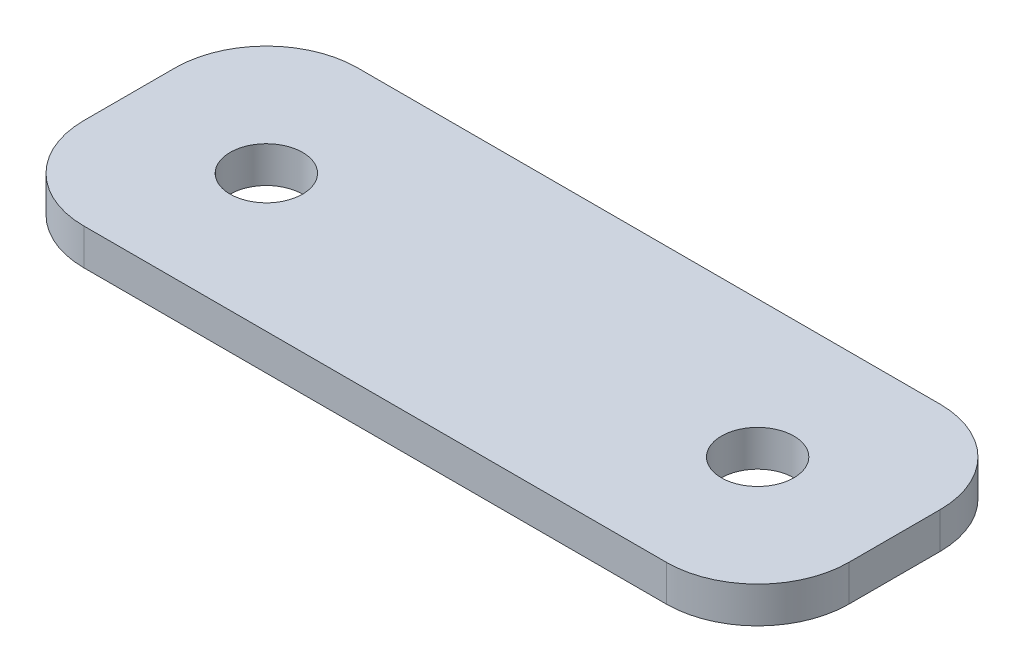
ISO-10303-21;
HEADER;
FILE_DESCRIPTION(('STEP AP214'),'2;1');
FILE_NAME('part.step','',(''),(''),'','','');
FILE_SCHEMA(('AUTOMOTIVE_DESIGN { 1 0 10303 214 1 1 1 1 }'));
ENDSEC;
DATA;
#1=APPLICATION_CONTEXT('core data for automotive mechanical design processes');
#2=APPLICATION_PROTOCOL_DEFINITION('international standard','automotive_design',2000,#1);
#3=PRODUCT_CONTEXT('',#1,'mechanical');
#4=PRODUCT('Part','Part','',(#3));
#5=PRODUCT_RELATED_PRODUCT_CATEGORY('part','',(#4));
#6=PRODUCT_DEFINITION_FORMATION('','',#4);
#7=PRODUCT_DEFINITION_CONTEXT('part definition',#1,'design');
#8=PRODUCT_DEFINITION('design','',#6,#7);
#9=PRODUCT_DEFINITION_SHAPE('','',#8);
#10=(LENGTH_UNIT() NAMED_UNIT(*) SI_UNIT(.MILLI.,.METRE.));
#11=(NAMED_UNIT(*) PLANE_ANGLE_UNIT() SI_UNIT($,.RADIAN.));
#12=(NAMED_UNIT(*) SI_UNIT($,.STERADIAN.) SOLID_ANGLE_UNIT());
#13=UNCERTAINTY_MEASURE_WITH_UNIT(LENGTH_MEASURE(1.E-05),#10,'distance_accuracy_value','');
#14=(GEOMETRIC_REPRESENTATION_CONTEXT(3) GLOBAL_UNCERTAINTY_ASSIGNED_CONTEXT((#13)) GLOBAL_UNIT_ASSIGNED_CONTEXT((#10,
#11,#12)) REPRESENTATION_CONTEXT('',''));
#15=CARTESIAN_POINT('',(0.,0.,0.));
#16=DIRECTION('',(0.,0.,1.));
#17=DIRECTION('',(1.,0.,0.));
#18=AXIS2_PLACEMENT_3D('',#15,#16,#17);
#19=CARTESIAN_POINT('',(0.,0.79375,0.));
#20=DIRECTION('',(0.,1.,0.));
#21=DIRECTION('',(0.,0.,1.));
#22=AXIS2_PLACEMENT_3D('',#19,#20,#21);
#23=PLANE('',#22);
#24=CARTESIAN_POINT('',(-10.765,0.79375,0.));
#25=DIRECTION('',(0.,1.,0.));
#26=DIRECTION('',(0.,0.,1.));
#27=AXIS2_PLACEMENT_3D('',#24,#25,#26);
#28=CIRCLE('',#27,1.5875);
#29=CARTESIAN_POINT('',(-10.765,0.79375,1.5875));
#30=VERTEX_POINT('',#29);
#31=EDGE_CURVE('E172',#30,#30,#28,.T.);
#32=ORIENTED_EDGE('',*,*,#31,.F.);
#33=EDGE_LOOP('',(#32));
#34=FACE_BOUND('',#33,.T.);
#35=DIRECTION('',(1.,0.,0.));
#36=VECTOR('',#35,1.);
#37=CARTESIAN_POINT('',(16.765,0.79375,6.));
#38=LINE('',#37,#36);
#39=CARTESIAN_POINT('',(-12.765,0.79375,6.));
#40=VERTEX_POINT('',#39);
#41=CARTESIAN_POINT('',(12.765,0.79375,6.));
#42=VERTEX_POINT('',#41);
#43=EDGE_CURVE('E167',#40,#42,#38,.T.);
#44=ORIENTED_EDGE('',*,*,#43,.T.);
#45=CARTESIAN_POINT('',(12.765,0.79375,2.));
#46=DIRECTION('',(0.,1.,0.));
#47=DIRECTION('',(0.,0.,1.));
#48=AXIS2_PLACEMENT_3D('',#45,#46,#47);
#49=CIRCLE('',#48,4.);
#50=CARTESIAN_POINT('',(16.765,0.79375,2.));
#51=VERTEX_POINT('',#50);
#52=EDGE_CURVE('E148',#42,#51,#49,.T.);
#53=ORIENTED_EDGE('',*,*,#52,.T.);
#54=DIRECTION('',(0.,0.,-1.));
#55=VECTOR('',#54,1.);
#56=CARTESIAN_POINT('',(16.765,0.79375,6.));
#57=LINE('',#56,#55);
#58=CARTESIAN_POINT('',(16.765,0.79375,-2.));
#59=VERTEX_POINT('',#58);
#60=EDGE_CURVE('E118',#51,#59,#57,.T.);
#61=ORIENTED_EDGE('',*,*,#60,.T.);
#62=CARTESIAN_POINT('',(12.765,0.79375,-2.));
#63=DIRECTION('',(0.,1.,0.));
#64=DIRECTION('',(0.,0.,1.));
#65=AXIS2_PLACEMENT_3D('',#62,#63,#64);
#66=CIRCLE('',#65,4.);
#67=CARTESIAN_POINT('',(12.765,0.79375,-6.));
#68=VERTEX_POINT('',#67);
#69=EDGE_CURVE('E54',#59,#68,#66,.T.);
#70=ORIENTED_EDGE('',*,*,#69,.T.);
#71=DIRECTION('',(-1.,0.,0.));
#72=VECTOR('',#71,1.);
#73=CARTESIAN_POINT('',(16.765,0.79375,-6.));
#74=LINE('',#73,#72);
#75=CARTESIAN_POINT('',(-12.765,0.79375,-6.));
#76=VERTEX_POINT('',#75);
#77=EDGE_CURVE('E134',#68,#76,#74,.T.);
#78=ORIENTED_EDGE('',*,*,#77,.T.);
#79=CARTESIAN_POINT('',(-12.765,0.79375,-2.));
#80=DIRECTION('',(0.,1.,0.));
#81=DIRECTION('',(0.,0.,1.));
#82=AXIS2_PLACEMENT_3D('',#79,#80,#81);
#83=CIRCLE('',#82,4.);
#84=CARTESIAN_POINT('',(-16.765,0.79375,-2.));
#85=VERTEX_POINT('',#84);
#86=EDGE_CURVE('E145',#76,#85,#83,.T.);
#87=ORIENTED_EDGE('',*,*,#86,.T.);
#88=DIRECTION('',(0.,0.,1.));
#89=VECTOR('',#88,1.);
#90=CARTESIAN_POINT('',(-16.765,0.79375,6.));
#91=LINE('',#90,#89);
#92=CARTESIAN_POINT('',(-16.765,0.79375,2.));
#93=VERTEX_POINT('',#92);
#94=EDGE_CURVE('E128',#85,#93,#91,.T.);
#95=ORIENTED_EDGE('',*,*,#94,.T.);
#96=CARTESIAN_POINT('',(-12.765,0.79375,2.));
#97=DIRECTION('',(0.,1.,0.));
#98=DIRECTION('',(0.,0.,1.));
#99=AXIS2_PLACEMENT_3D('',#96,#97,#98);
#100=CIRCLE('',#99,4.);
#101=EDGE_CURVE('E143',#93,#40,#100,.T.);
#102=ORIENTED_EDGE('',*,*,#101,.T.);
#103=EDGE_LOOP('',(#44,#53,#61,#70,#78,#87,#95,#102));
#104=FACE_BOUND('',#103,.T.);
#105=CARTESIAN_POINT('',(10.765,0.79375,0.));
#106=DIRECTION('',(0.,1.,0.));
#107=DIRECTION('',(0.,0.,1.));
#108=AXIS2_PLACEMENT_3D('',#105,#106,#107);
#109=CIRCLE('',#108,1.5875);
#110=CARTESIAN_POINT('',(10.765,0.79375,1.5875));
#111=VERTEX_POINT('',#110);
#112=EDGE_CURVE('E181',#111,#111,#109,.T.);
#113=ORIENTED_EDGE('',*,*,#112,.F.);
#114=EDGE_LOOP('',(#113));
#115=FACE_BOUND('',#114,.T.);
#116=ADVANCED_FACE('F32',(#34,#104,#115),#23,.T.);
#117=CARTESIAN_POINT('',(0.,-0.79375,0.));
#118=DIRECTION('',(0.,1.,0.));
#119=DIRECTION('',(0.,0.,1.));
#120=AXIS2_PLACEMENT_3D('',#117,#118,#119);
#121=PLANE('',#120);
#122=CARTESIAN_POINT('',(-10.765,-0.79375,0.));
#123=DIRECTION('',(0.,1.,0.));
#124=DIRECTION('',(0.,0.,1.));
#125=AXIS2_PLACEMENT_3D('',#122,#123,#124);
#126=CIRCLE('',#125,1.5875);
#127=CARTESIAN_POINT('',(-10.765,-0.79375,1.5875));
#128=VERTEX_POINT('',#127);
#129=EDGE_CURVE('E174',#128,#128,#126,.T.);
#130=ORIENTED_EDGE('',*,*,#129,.T.);
#131=EDGE_LOOP('',(#130));
#132=FACE_BOUND('',#131,.T.);
#133=DIRECTION('',(0.,0.,-1.));
#134=VECTOR('',#133,1.);
#135=CARTESIAN_POINT('',(16.765,-0.79375,6.));
#136=LINE('',#135,#134);
#137=CARTESIAN_POINT('',(16.765,-0.79375,2.));
#138=VERTEX_POINT('',#137);
#139=CARTESIAN_POINT('',(16.765,-0.79375,-2.));
#140=VERTEX_POINT('',#139);
#141=EDGE_CURVE('E116',#138,#140,#136,.T.);
#142=ORIENTED_EDGE('',*,*,#141,.F.);
#143=CARTESIAN_POINT('',(12.765,-0.79375,2.));
#144=DIRECTION('',(0.,1.,0.));
#145=DIRECTION('',(0.,0.,1.));
#146=AXIS2_PLACEMENT_3D('',#143,#144,#145);
#147=CIRCLE('',#146,4.);
#148=CARTESIAN_POINT('',(12.765,-0.79375,6.));
#149=VERTEX_POINT('',#148);
#150=EDGE_CURVE('E99',#138,#149,#147,.F.);
#151=ORIENTED_EDGE('',*,*,#150,.T.);
#152=DIRECTION('',(1.,0.,0.));
#153=VECTOR('',#152,1.);
#154=CARTESIAN_POINT('',(16.765,-0.79375,6.));
#155=LINE('',#154,#153);
#156=CARTESIAN_POINT('',(-12.765,-0.79375,6.));
#157=VERTEX_POINT('',#156);
#158=EDGE_CURVE('E126',#157,#149,#155,.T.);
#159=ORIENTED_EDGE('',*,*,#158,.F.);
#160=CARTESIAN_POINT('',(-12.765,-0.79375,2.));
#161=DIRECTION('',(0.,1.,0.));
#162=DIRECTION('',(0.,0.,1.));
#163=AXIS2_PLACEMENT_3D('',#160,#161,#162);
#164=CIRCLE('',#163,4.);
#165=CARTESIAN_POINT('',(-16.765,-0.79375,2.));
#166=VERTEX_POINT('',#165);
#167=EDGE_CURVE('E119',#157,#166,#164,.F.);
#168=ORIENTED_EDGE('',*,*,#167,.T.);
#169=DIRECTION('',(0.,0.,1.));
#170=VECTOR('',#169,1.);
#171=CARTESIAN_POINT('',(-16.765,-0.79375,6.));
#172=LINE('',#171,#170);
#173=CARTESIAN_POINT('',(-16.765,-0.79375,-2.));
#174=VERTEX_POINT('',#173);
#175=EDGE_CURVE('E130',#174,#166,#172,.T.);
#176=ORIENTED_EDGE('',*,*,#175,.F.);
#177=CARTESIAN_POINT('',(-12.765,-0.79375,-2.));
#178=DIRECTION('',(0.,1.,0.));
#179=DIRECTION('',(0.,0.,1.));
#180=AXIS2_PLACEMENT_3D('',#177,#178,#179);
#181=CIRCLE('',#180,4.);
#182=CARTESIAN_POINT('',(-12.765,-0.79375,-6.));
#183=VERTEX_POINT('',#182);
#184=EDGE_CURVE('E137',#174,#183,#181,.F.);
#185=ORIENTED_EDGE('',*,*,#184,.T.);
#186=DIRECTION('',(-1.,0.,0.));
#187=VECTOR('',#186,1.);
#188=CARTESIAN_POINT('',(16.765,-0.79375,-6.));
#189=LINE('',#188,#187);
#190=CARTESIAN_POINT('',(12.765,-0.79375,-6.));
#191=VERTEX_POINT('',#190);
#192=EDGE_CURVE('E125',#191,#183,#189,.T.);
#193=ORIENTED_EDGE('',*,*,#192,.F.);
#194=CARTESIAN_POINT('',(12.765,-0.79375,-2.));
#195=DIRECTION('',(0.,1.,0.));
#196=DIRECTION('',(0.,0.,1.));
#197=AXIS2_PLACEMENT_3D('',#194,#195,#196);
#198=CIRCLE('',#197,4.);
#199=EDGE_CURVE('E110',#191,#140,#198,.F.);
#200=ORIENTED_EDGE('',*,*,#199,.T.);
#201=EDGE_LOOP('',(#142,#151,#159,#168,#176,#185,#193,#200));
#202=FACE_BOUND('',#201,.T.);
#203=CARTESIAN_POINT('',(10.765,-0.79375,0.));
#204=DIRECTION('',(0.,1.,0.));
#205=DIRECTION('',(0.,0.,1.));
#206=AXIS2_PLACEMENT_3D('',#203,#204,#205);
#207=CIRCLE('',#206,1.5875);
#208=CARTESIAN_POINT('',(10.765,-0.79375,1.5875));
#209=VERTEX_POINT('',#208);
#210=EDGE_CURVE('E183',#209,#209,#207,.T.);
#211=ORIENTED_EDGE('',*,*,#210,.T.);
#212=EDGE_LOOP('',(#211));
#213=FACE_BOUND('',#212,.T.);
#214=ADVANCED_FACE('F122',(#132,#202,#213),#121,.F.);
#215=CARTESIAN_POINT('',(-16.765,0.79375,6.));
#216=DIRECTION('',(1.,0.,0.));
#217=DIRECTION('',(0.,0.,-1.));
#218=AXIS2_PLACEMENT_3D('',#215,#216,#217);
#219=PLANE('',#218);
#220=ORIENTED_EDGE('',*,*,#94,.F.);
#221=DIRECTION('',(0.,-1.,0.));
#222=VECTOR('',#221,1.);
#223=CARTESIAN_POINT('',(-16.765,0.79375,-2.));
#224=LINE('',#223,#222);
#225=EDGE_CURVE('E11',#85,#174,#224,.T.);
#226=ORIENTED_EDGE('',*,*,#225,.T.);
#227=ORIENTED_EDGE('',*,*,#175,.T.);
#228=DIRECTION('',(0.,-1.,0.));
#229=VECTOR('',#228,1.);
#230=CARTESIAN_POINT('',(-16.765,0.79375,2.));
#231=LINE('',#230,#229);
#232=EDGE_CURVE('E40',#166,#93,#231,.F.);
#233=ORIENTED_EDGE('',*,*,#232,.T.);
#234=EDGE_LOOP('',(#220,#226,#227,#233));
#235=FACE_BOUND('',#234,.T.);
#236=ADVANCED_FACE('F158',(#235),#219,.F.);
#237=CARTESIAN_POINT('',(16.765,0.79375,6.));
#238=DIRECTION('',(0.,0.,-1.));
#239=DIRECTION('',(-1.,0.,0.));
#240=AXIS2_PLACEMENT_3D('',#237,#238,#239);
#241=PLANE('',#240);
#242=ORIENTED_EDGE('',*,*,#158,.T.);
#243=DIRECTION('',(0.,-1.,0.));
#244=VECTOR('',#243,1.);
#245=CARTESIAN_POINT('',(12.765,0.79375,6.));
#246=LINE('',#245,#244);
#247=EDGE_CURVE('E104',#149,#42,#246,.F.);
#248=ORIENTED_EDGE('',*,*,#247,.T.);
#249=ORIENTED_EDGE('',*,*,#43,.F.);
#250=DIRECTION('',(0.,-1.,0.));
#251=VECTOR('',#250,1.);
#252=CARTESIAN_POINT('',(-12.765,0.79375,6.));
#253=LINE('',#252,#251);
#254=EDGE_CURVE('E109',#40,#157,#253,.T.);
#255=ORIENTED_EDGE('',*,*,#254,.T.);
#256=EDGE_LOOP('',(#242,#248,#249,#255));
#257=FACE_BOUND('',#256,.T.);
#258=ADVANCED_FACE('F171',(#257),#241,.F.);
#259=CARTESIAN_POINT('',(16.765,0.79375,6.));
#260=DIRECTION('',(-1.,0.,0.));
#261=DIRECTION('',(0.,0.,1.));
#262=AXIS2_PLACEMENT_3D('',#259,#260,#261);
#263=PLANE('',#262);
#264=ORIENTED_EDGE('',*,*,#60,.F.);
#265=DIRECTION('',(0.,-1.,0.));
#266=VECTOR('',#265,1.);
#267=CARTESIAN_POINT('',(16.765,0.79375,2.));
#268=LINE('',#267,#266);
#269=EDGE_CURVE('E103',#51,#138,#268,.T.);
#270=ORIENTED_EDGE('',*,*,#269,.T.);
#271=ORIENTED_EDGE('',*,*,#141,.T.);
#272=DIRECTION('',(0.,-1.,0.));
#273=VECTOR('',#272,1.);
#274=CARTESIAN_POINT('',(16.765,0.79375,-2.));
#275=LINE('',#274,#273);
#276=EDGE_CURVE('E120',#140,#59,#275,.F.);
#277=ORIENTED_EDGE('',*,*,#276,.T.);
#278=EDGE_LOOP('',(#264,#270,#271,#277));
#279=FACE_BOUND('',#278,.T.);
#280=ADVANCED_FACE('F115',(#279),#263,.F.);
#281=CARTESIAN_POINT('',(16.765,0.79375,-6.));
#282=DIRECTION('',(0.,0.,1.));
#283=DIRECTION('',(1.,0.,0.));
#284=AXIS2_PLACEMENT_3D('',#281,#282,#283);
#285=PLANE('',#284);
#286=ORIENTED_EDGE('',*,*,#77,.F.);
#287=DIRECTION('',(0.,-1.,0.));
#288=VECTOR('',#287,1.);
#289=CARTESIAN_POINT('',(12.765,0.79375,-6.));
#290=LINE('',#289,#288);
#291=EDGE_CURVE('E151',#68,#191,#290,.T.);
#292=ORIENTED_EDGE('',*,*,#291,.T.);
#293=ORIENTED_EDGE('',*,*,#192,.T.);
#294=DIRECTION('',(0.,-1.,0.));
#295=VECTOR('',#294,1.);
#296=CARTESIAN_POINT('',(-12.765,0.79375,-6.));
#297=LINE('',#296,#295);
#298=EDGE_CURVE('E47',#183,#76,#297,.F.);
#299=ORIENTED_EDGE('',*,*,#298,.T.);
#300=EDGE_LOOP('',(#286,#292,#293,#299));
#301=FACE_BOUND('',#300,.T.);
#302=ADVANCED_FACE('F205',(#301),#285,.F.);
#303=CARTESIAN_POINT('',(-10.765,0.79375,0.));
#304=DIRECTION('',(0.,-1.,0.));
#305=DIRECTION('',(0.,0.,-1.));
#306=AXIS2_PLACEMENT_3D('',#303,#304,#305);
#307=CYLINDRICAL_SURFACE('',#306,1.5875);
#308=ORIENTED_EDGE('',*,*,#31,.T.);
#309=EDGE_LOOP('',(#308));
#310=FACE_BOUND('',#309,.T.);
#311=ORIENTED_EDGE('',*,*,#129,.F.);
#312=EDGE_LOOP('',(#311));
#313=FACE_BOUND('',#312,.T.);
#314=ADVANCED_FACE('F202',(#310,#313),#307,.F.);
#315=CARTESIAN_POINT('',(10.765,0.79375,0.));
#316=DIRECTION('',(0.,-1.,0.));
#317=DIRECTION('',(0.,0.,-1.));
#318=AXIS2_PLACEMENT_3D('',#315,#316,#317);
#319=CYLINDRICAL_SURFACE('',#318,1.5875);
#320=ORIENTED_EDGE('',*,*,#112,.T.);
#321=EDGE_LOOP('',(#320));
#322=FACE_BOUND('',#321,.T.);
#323=ORIENTED_EDGE('',*,*,#210,.F.);
#324=EDGE_LOOP('',(#323));
#325=FACE_BOUND('',#324,.T.);
#326=ADVANCED_FACE('F189',(#322,#325),#319,.F.);
#327=CARTESIAN_POINT('',(12.765,0.79375,2.));
#328=DIRECTION('',(0.,-1.,0.));
#329=DIRECTION('',(0.,0.,-1.));
#330=AXIS2_PLACEMENT_3D('',#327,#328,#329);
#331=CYLINDRICAL_SURFACE('',#330,4.);
#332=ORIENTED_EDGE('',*,*,#52,.F.);
#333=ORIENTED_EDGE('',*,*,#247,.F.);
#334=ORIENTED_EDGE('',*,*,#150,.F.);
#335=ORIENTED_EDGE('',*,*,#269,.F.);
#336=EDGE_LOOP('',(#332,#333,#334,#335));
#337=FACE_BOUND('',#336,.T.);
#338=ADVANCED_FACE('F102',(#337),#331,.T.);
#339=CARTESIAN_POINT('',(12.765,0.79375,-2.));
#340=DIRECTION('',(0.,-1.,0.));
#341=DIRECTION('',(0.,0.,-1.));
#342=AXIS2_PLACEMENT_3D('',#339,#340,#341);
#343=CYLINDRICAL_SURFACE('',#342,4.);
#344=ORIENTED_EDGE('',*,*,#69,.F.);
#345=ORIENTED_EDGE('',*,*,#276,.F.);
#346=ORIENTED_EDGE('',*,*,#199,.F.);
#347=ORIENTED_EDGE('',*,*,#291,.F.);
#348=EDGE_LOOP('',(#344,#345,#346,#347));
#349=FACE_BOUND('',#348,.T.);
#350=ADVANCED_FACE('F216',(#349),#343,.T.);
#351=CARTESIAN_POINT('',(-12.765,0.79375,-2.));
#352=DIRECTION('',(0.,-1.,0.));
#353=DIRECTION('',(0.,0.,-1.));
#354=AXIS2_PLACEMENT_3D('',#351,#352,#353);
#355=CYLINDRICAL_SURFACE('',#354,4.);
#356=ORIENTED_EDGE('',*,*,#86,.F.);
#357=ORIENTED_EDGE('',*,*,#298,.F.);
#358=ORIENTED_EDGE('',*,*,#184,.F.);
#359=ORIENTED_EDGE('',*,*,#225,.F.);
#360=EDGE_LOOP('',(#356,#357,#358,#359));
#361=FACE_BOUND('',#360,.T.);
#362=ADVANCED_FACE('F218',(#361),#355,.T.);
#363=CARTESIAN_POINT('',(-12.765,0.79375,2.));
#364=DIRECTION('',(0.,-1.,0.));
#365=DIRECTION('',(0.,0.,-1.));
#366=AXIS2_PLACEMENT_3D('',#363,#364,#365);
#367=CYLINDRICAL_SURFACE('',#366,4.);
#368=ORIENTED_EDGE('',*,*,#101,.F.);
#369=ORIENTED_EDGE('',*,*,#232,.F.);
#370=ORIENTED_EDGE('',*,*,#167,.F.);
#371=ORIENTED_EDGE('',*,*,#254,.F.);
#372=EDGE_LOOP('',(#368,#369,#370,#371));
#373=FACE_BOUND('',#372,.T.);
#374=ADVANCED_FACE('F34',(#373),#367,.T.);
#375=CLOSED_SHELL('',(#116,#214,#236,#258,#280,#302,#314,#326,#338,#350,#362,#374));
#376=MANIFOLD_SOLID_BREP('B2',#375);
#377=ADVANCED_BREP_SHAPE_REPRESENTATION('',(#18,#376),#14);
#378=SHAPE_DEFINITION_REPRESENTATION(#9,#377);
ENDSEC;
END-ISO-10303-21;
